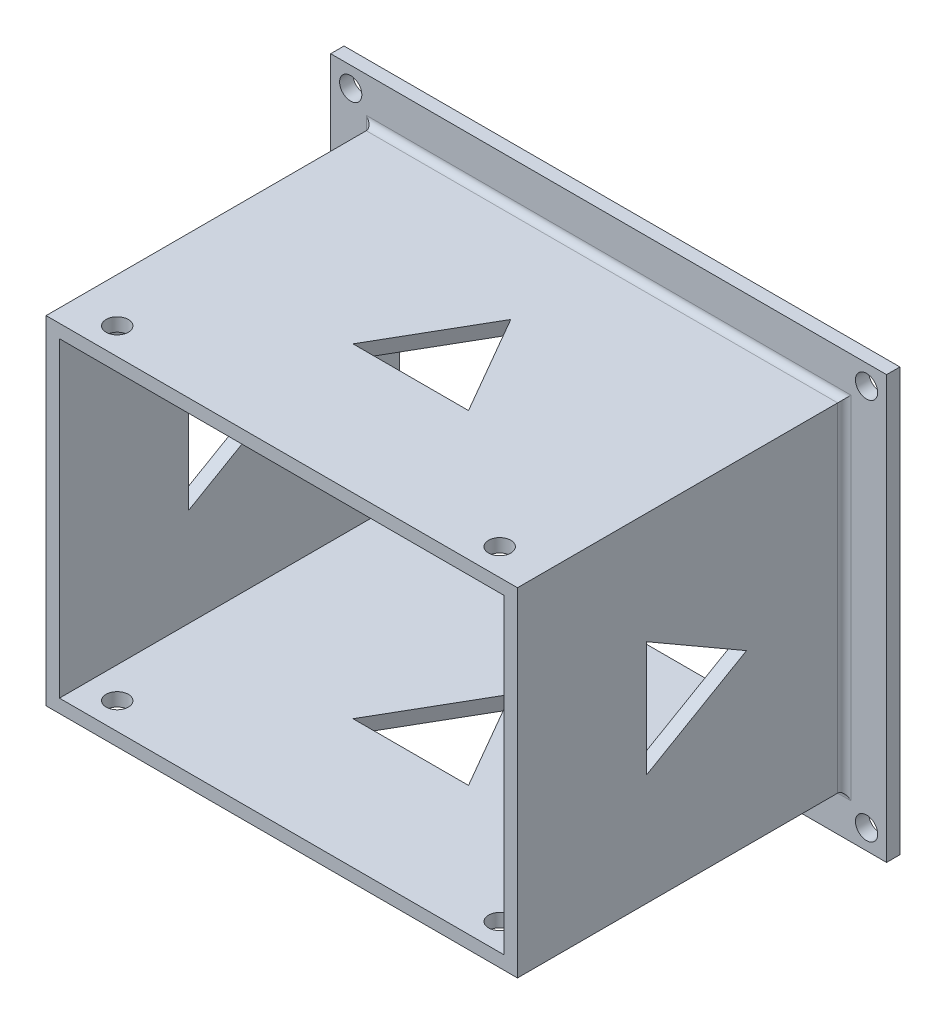
ISO-10303-21;
HEADER;
FILE_DESCRIPTION(('STEP AP214'),'2;1');
FILE_NAME('part.step','',(''),(''),'','','');
FILE_SCHEMA(('AUTOMOTIVE_DESIGN { 1 0 10303 214 1 1 1 1 }'));
ENDSEC;
DATA;
#1=APPLICATION_CONTEXT('core data for automotive mechanical design processes');
#2=APPLICATION_PROTOCOL_DEFINITION('international standard','automotive_design',2000,#1);
#3=PRODUCT_CONTEXT('',#1,'mechanical');
#4=PRODUCT('Part','Part','',(#3));
#5=PRODUCT_RELATED_PRODUCT_CATEGORY('part','',(#4));
#6=PRODUCT_DEFINITION_FORMATION('','',#4);
#7=PRODUCT_DEFINITION_CONTEXT('part definition',#1,'design');
#8=PRODUCT_DEFINITION('design','',#6,#7);
#9=PRODUCT_DEFINITION_SHAPE('','',#8);
#10=(LENGTH_UNIT() NAMED_UNIT(*) SI_UNIT(.MILLI.,.METRE.));
#11=(NAMED_UNIT(*) PLANE_ANGLE_UNIT() SI_UNIT($,.RADIAN.));
#12=(NAMED_UNIT(*) SI_UNIT($,.STERADIAN.) SOLID_ANGLE_UNIT());
#13=UNCERTAINTY_MEASURE_WITH_UNIT(LENGTH_MEASURE(1.E-05),#10,'distance_accuracy_value','');
#14=(GEOMETRIC_REPRESENTATION_CONTEXT(3) GLOBAL_UNCERTAINTY_ASSIGNED_CONTEXT((#13)) GLOBAL_UNIT_ASSIGNED_CONTEXT((#10,
#11,#12)) REPRESENTATION_CONTEXT('',''));
#15=CARTESIAN_POINT('',(0.,0.,0.));
#16=DIRECTION('',(0.,0.,1.));
#17=DIRECTION('',(1.,0.,0.));
#18=AXIS2_PLACEMENT_3D('',#15,#16,#17);
#19=CARTESIAN_POINT('',(0.,0.,3.));
#20=DIRECTION('',(0.,0.,1.));
#21=DIRECTION('',(1.,0.,0.));
#22=AXIS2_PLACEMENT_3D('',#19,#20,#21);
#23=PLANE('',#22);
#24=CARTESIAN_POINT('',(-58.,-43.,3.));
#25=DIRECTION('',(0.,0.,1.));
#26=DIRECTION('',(-1.,0.,0.));
#27=AXIS2_PLACEMENT_3D('',#24,#25,#26);
#28=CIRCLE('',#27,2.5);
#29=CARTESIAN_POINT('',(-60.5,-43.,3.));
#30=VERTEX_POINT('',#29);
#31=EDGE_CURVE('E331',#30,#30,#28,.T.);
#32=ORIENTED_EDGE('',*,*,#31,.F.);
#33=EDGE_LOOP('',(#32));
#34=FACE_BOUND('',#33,.T.);
#35=CARTESIAN_POINT('',(58.,-43.,3.));
#36=DIRECTION('',(0.,0.,1.));
#37=DIRECTION('',(1.,0.,0.));
#38=AXIS2_PLACEMENT_3D('',#35,#36,#37);
#39=CIRCLE('',#38,2.5);
#40=CARTESIAN_POINT('',(60.5,-43.,3.));
#41=VERTEX_POINT('',#40);
#42=EDGE_CURVE('E337',#41,#41,#39,.T.);
#43=ORIENTED_EDGE('',*,*,#42,.F.);
#44=EDGE_LOOP('',(#43));
#45=FACE_BOUND('',#44,.T.);
#46=CARTESIAN_POINT('',(58.,43.,3.));
#47=DIRECTION('',(0.,0.,1.));
#48=DIRECTION('',(-1.,0.,0.));
#49=AXIS2_PLACEMENT_3D('',#46,#47,#48);
#50=CIRCLE('',#49,2.5);
#51=CARTESIAN_POINT('',(55.5,43.,3.));
#52=VERTEX_POINT('',#51);
#53=EDGE_CURVE('E332',#52,#52,#50,.T.);
#54=ORIENTED_EDGE('',*,*,#53,.F.);
#55=EDGE_LOOP('',(#54));
#56=FACE_BOUND('',#55,.T.);
#57=CARTESIAN_POINT('',(-58.,43.,3.));
#58=DIRECTION('',(0.,0.,1.));
#59=DIRECTION('',(1.,0.,0.));
#60=AXIS2_PLACEMENT_3D('',#57,#58,#59);
#61=CIRCLE('',#60,2.5);
#62=CARTESIAN_POINT('',(-55.5,43.,3.));
#63=VERTEX_POINT('',#62);
#64=EDGE_CURVE('E336',#63,#63,#61,.T.);
#65=ORIENTED_EDGE('',*,*,#64,.F.);
#66=EDGE_LOOP('',(#65));
#67=FACE_BOUND('',#66,.T.);
#68=DIRECTION('',(0.,1.,0.));
#69=VECTOR('',#68,1.);
#70=CARTESIAN_POINT('',(54.5,0.,3.));
#71=LINE('',#70,#69);
#72=CARTESIAN_POINT('',(54.5,39.5,3.));
#73=VERTEX_POINT('',#72);
#74=CARTESIAN_POINT('',(54.5,-39.5,3.));
#75=VERTEX_POINT('',#74);
#76=EDGE_CURVE('E502',#73,#75,#71,.F.);
#77=ORIENTED_EDGE('',*,*,#76,.T.);
#78=DIRECTION('',(1.,0.,0.));
#79=VECTOR('',#78,1.);
#80=CARTESIAN_POINT('',(0.,-39.5,3.));
#81=LINE('',#80,#79);
#82=CARTESIAN_POINT('',(-54.5,-39.5,3.));
#83=VERTEX_POINT('',#82);
#84=EDGE_CURVE('E511',#75,#83,#81,.F.);
#85=ORIENTED_EDGE('',*,*,#84,.T.);
#86=DIRECTION('',(0.,-1.,0.));
#87=VECTOR('',#86,1.);
#88=CARTESIAN_POINT('',(-54.5,0.,3.));
#89=LINE('',#88,#87);
#90=CARTESIAN_POINT('',(-54.5,39.5,3.));
#91=VERTEX_POINT('',#90);
#92=EDGE_CURVE('E508',#83,#91,#89,.F.);
#93=ORIENTED_EDGE('',*,*,#92,.T.);
#94=DIRECTION('',(-1.,0.,0.));
#95=VECTOR('',#94,1.);
#96=CARTESIAN_POINT('',(0.,39.5,3.));
#97=LINE('',#96,#95);
#98=EDGE_CURVE('E505',#91,#73,#97,.F.);
#99=ORIENTED_EDGE('',*,*,#98,.T.);
#100=EDGE_LOOP('',(#77,#85,#93,#99));
#101=FACE_BOUND('',#100,.T.);
#102=DIRECTION('',(0.,1.,0.));
#103=VECTOR('',#102,1.);
#104=CARTESIAN_POINT('',(62.5,47.5,3.));
#105=LINE('',#104,#103);
#106=CARTESIAN_POINT('',(62.5,-47.5,3.));
#107=VERTEX_POINT('',#106);
#108=CARTESIAN_POINT('',(62.5,47.5,3.));
#109=VERTEX_POINT('',#108);
#110=EDGE_CURVE('E457',#107,#109,#105,.T.);
#111=ORIENTED_EDGE('',*,*,#110,.T.);
#112=DIRECTION('',(-1.,0.,0.));
#113=VECTOR('',#112,1.);
#114=CARTESIAN_POINT('',(-62.5,47.5,3.));
#115=LINE('',#114,#113);
#116=CARTESIAN_POINT('',(-62.5,47.5,3.));
#117=VERTEX_POINT('',#116);
#118=EDGE_CURVE('E461',#109,#117,#115,.T.);
#119=ORIENTED_EDGE('',*,*,#118,.T.);
#120=DIRECTION('',(0.,-1.,0.));
#121=VECTOR('',#120,1.);
#122=CARTESIAN_POINT('',(-62.5,47.5,3.));
#123=LINE('',#122,#121);
#124=CARTESIAN_POINT('',(-62.5,-47.5,3.));
#125=VERTEX_POINT('',#124);
#126=EDGE_CURVE('E465',#117,#125,#123,.T.);
#127=ORIENTED_EDGE('',*,*,#126,.T.);
#128=DIRECTION('',(1.,0.,0.));
#129=VECTOR('',#128,1.);
#130=CARTESIAN_POINT('',(-62.5,-47.5,3.));
#131=LINE('',#130,#129);
#132=EDGE_CURVE('E468',#125,#107,#131,.T.);
#133=ORIENTED_EDGE('',*,*,#132,.T.);
#134=EDGE_LOOP('',(#111,#119,#127,#133));
#135=FACE_BOUND('',#134,.T.);
#136=ADVANCED_FACE('F39',(#34,#45,#56,#67,#101,#135),#23,.T.);
#137=CARTESIAN_POINT('',(0.,0.,0.));
#138=DIRECTION('',(0.,0.,1.));
#139=DIRECTION('',(1.,0.,0.));
#140=AXIS2_PLACEMENT_3D('',#137,#138,#139);
#141=PLANE('',#140);
#142=CARTESIAN_POINT('',(-58.,-43.,0.));
#143=DIRECTION('',(0.,0.,1.));
#144=DIRECTION('',(1.,0.,0.));
#145=AXIS2_PLACEMENT_3D('',#142,#143,#144);
#146=CIRCLE('',#145,2.5);
#147=CARTESIAN_POINT('',(-55.5,-43.,0.));
#148=VERTEX_POINT('',#147);
#149=EDGE_CURVE('E43',#148,#148,#146,.T.);
#150=ORIENTED_EDGE('',*,*,#149,.T.);
#151=EDGE_LOOP('',(#150));
#152=FACE_BOUND('',#151,.T.);
#153=CARTESIAN_POINT('',(58.,-43.,0.));
#154=DIRECTION('',(0.,0.,1.));
#155=DIRECTION('',(1.,0.,0.));
#156=AXIS2_PLACEMENT_3D('',#153,#154,#155);
#157=CIRCLE('',#156,2.5);
#158=CARTESIAN_POINT('',(60.5,-43.,0.));
#159=VERTEX_POINT('',#158);
#160=EDGE_CURVE('E539',#159,#159,#157,.T.);
#161=ORIENTED_EDGE('',*,*,#160,.T.);
#162=EDGE_LOOP('',(#161));
#163=FACE_BOUND('',#162,.T.);
#164=CARTESIAN_POINT('',(58.,43.,0.));
#165=DIRECTION('',(0.,0.,1.));
#166=DIRECTION('',(1.,0.,0.));
#167=AXIS2_PLACEMENT_3D('',#164,#165,#166);
#168=CIRCLE('',#167,2.5);
#169=CARTESIAN_POINT('',(60.5,43.,0.));
#170=VERTEX_POINT('',#169);
#171=EDGE_CURVE('E536',#170,#170,#168,.T.);
#172=ORIENTED_EDGE('',*,*,#171,.T.);
#173=EDGE_LOOP('',(#172));
#174=FACE_BOUND('',#173,.T.);
#175=CARTESIAN_POINT('',(-58.,43.,0.));
#176=DIRECTION('',(0.,0.,1.));
#177=DIRECTION('',(1.,0.,0.));
#178=AXIS2_PLACEMENT_3D('',#175,#176,#177);
#179=CIRCLE('',#178,2.5);
#180=CARTESIAN_POINT('',(-55.5,43.,0.));
#181=VERTEX_POINT('',#180);
#182=EDGE_CURVE('E347',#181,#181,#179,.T.);
#183=ORIENTED_EDGE('',*,*,#182,.T.);
#184=EDGE_LOOP('',(#183));
#185=FACE_BOUND('',#184,.T.);
#186=DIRECTION('',(0.,1.,0.));
#187=VECTOR('',#186,1.);
#188=CARTESIAN_POINT('',(62.5,47.5,0.));
#189=LINE('',#188,#187);
#190=CARTESIAN_POINT('',(62.5,-47.5,0.));
#191=VERTEX_POINT('',#190);
#192=CARTESIAN_POINT('',(62.5,47.5,0.));
#193=VERTEX_POINT('',#192);
#194=EDGE_CURVE('E456',#191,#193,#189,.T.);
#195=ORIENTED_EDGE('',*,*,#194,.F.);
#196=DIRECTION('',(1.,0.,0.));
#197=VECTOR('',#196,1.);
#198=CARTESIAN_POINT('',(-62.5,-47.5,0.));
#199=LINE('',#198,#197);
#200=CARTESIAN_POINT('',(-62.5,-47.5,0.));
#201=VERTEX_POINT('',#200);
#202=EDGE_CURVE('E462',#201,#191,#199,.T.);
#203=ORIENTED_EDGE('',*,*,#202,.F.);
#204=DIRECTION('',(0.,-1.,0.));
#205=VECTOR('',#204,1.);
#206=CARTESIAN_POINT('',(-62.5,47.5,0.));
#207=LINE('',#206,#205);
#208=CARTESIAN_POINT('',(-62.5,47.5,0.));
#209=VERTEX_POINT('',#208);
#210=EDGE_CURVE('E478',#209,#201,#207,.T.);
#211=ORIENTED_EDGE('',*,*,#210,.F.);
#212=DIRECTION('',(-1.,0.,0.));
#213=VECTOR('',#212,1.);
#214=CARTESIAN_POINT('',(-62.5,47.5,0.));
#215=LINE('',#214,#213);
#216=EDGE_CURVE('E475',#193,#209,#215,.T.);
#217=ORIENTED_EDGE('',*,*,#216,.F.);
#218=EDGE_LOOP('',(#195,#203,#211,#217));
#219=FACE_BOUND('',#218,.T.);
#220=DIRECTION('',(0.,1.,0.));
#221=VECTOR('',#220,1.);
#222=CARTESIAN_POINT('',(50.,35.,0.));
#223=LINE('',#222,#221);
#224=CARTESIAN_POINT('',(50.,-35.,0.));
#225=VERTEX_POINT('',#224);
#226=CARTESIAN_POINT('',(50.,35.,0.));
#227=VERTEX_POINT('',#226);
#228=EDGE_CURVE('E426',#225,#227,#223,.T.);
#229=ORIENTED_EDGE('',*,*,#228,.T.);
#230=DIRECTION('',(-1.,0.,0.));
#231=VECTOR('',#230,1.);
#232=CARTESIAN_POINT('',(-50.,35.,0.));
#233=LINE('',#232,#231);
#234=CARTESIAN_POINT('',(-50.,35.,0.));
#235=VERTEX_POINT('',#234);
#236=EDGE_CURVE('E430',#227,#235,#233,.T.);
#237=ORIENTED_EDGE('',*,*,#236,.T.);
#238=DIRECTION('',(0.,-1.,0.));
#239=VECTOR('',#238,1.);
#240=CARTESIAN_POINT('',(-50.,35.,0.));
#241=LINE('',#240,#239);
#242=CARTESIAN_POINT('',(-50.,-35.,0.));
#243=VERTEX_POINT('',#242);
#244=EDGE_CURVE('E434',#235,#243,#241,.T.);
#245=ORIENTED_EDGE('',*,*,#244,.T.);
#246=DIRECTION('',(1.,0.,0.));
#247=VECTOR('',#246,1.);
#248=CARTESIAN_POINT('',(-50.,-35.,0.));
#249=LINE('',#248,#247);
#250=EDGE_CURVE('E438',#243,#225,#249,.T.);
#251=ORIENTED_EDGE('',*,*,#250,.T.);
#252=EDGE_LOOP('',(#229,#237,#245,#251));
#253=FACE_BOUND('',#252,.T.);
#254=ADVANCED_FACE('F548',(#152,#163,#174,#185,#219,#253),#141,.F.);
#255=CARTESIAN_POINT('',(62.5,47.5,3.));
#256=DIRECTION('',(-1.,0.,0.));
#257=DIRECTION('',(0.,0.,1.));
#258=AXIS2_PLACEMENT_3D('',#255,#256,#257);
#259=PLANE('',#258);
#260=ORIENTED_EDGE('',*,*,#194,.T.);
#261=DIRECTION('',(0.,0.,-1.));
#262=VECTOR('',#261,1.);
#263=CARTESIAN_POINT('',(62.5,47.5,3.));
#264=LINE('',#263,#262);
#265=EDGE_CURVE('E494',#109,#193,#264,.T.);
#266=ORIENTED_EDGE('',*,*,#265,.F.);
#267=ORIENTED_EDGE('',*,*,#110,.F.);
#268=DIRECTION('',(0.,0.,-1.));
#269=VECTOR('',#268,1.);
#270=CARTESIAN_POINT('',(62.5,-47.5,3.));
#271=LINE('',#270,#269);
#272=EDGE_CURVE('E471',#107,#191,#271,.T.);
#273=ORIENTED_EDGE('',*,*,#272,.T.);
#274=EDGE_LOOP('',(#260,#266,#267,#273));
#275=FACE_BOUND('',#274,.T.);
#276=ADVANCED_FACE('F574',(#275),#259,.F.);
#277=CARTESIAN_POINT('',(-62.5,47.5,3.));
#278=DIRECTION('',(0.,-1.,0.));
#279=DIRECTION('',(0.,0.,-1.));
#280=AXIS2_PLACEMENT_3D('',#277,#278,#279);
#281=PLANE('',#280);
#282=ORIENTED_EDGE('',*,*,#216,.T.);
#283=DIRECTION('',(0.,0.,-1.));
#284=VECTOR('',#283,1.);
#285=CARTESIAN_POINT('',(-62.5,47.5,3.));
#286=LINE('',#285,#284);
#287=EDGE_CURVE('E490',#117,#209,#286,.T.);
#288=ORIENTED_EDGE('',*,*,#287,.F.);
#289=ORIENTED_EDGE('',*,*,#118,.F.);
#290=ORIENTED_EDGE('',*,*,#265,.T.);
#291=EDGE_LOOP('',(#282,#288,#289,#290));
#292=FACE_BOUND('',#291,.T.);
#293=ADVANCED_FACE('F589',(#292),#281,.F.);
#294=CARTESIAN_POINT('',(-62.5,47.5,3.));
#295=DIRECTION('',(1.,0.,0.));
#296=DIRECTION('',(0.,0.,-1.));
#297=AXIS2_PLACEMENT_3D('',#294,#295,#296);
#298=PLANE('',#297);
#299=ORIENTED_EDGE('',*,*,#210,.T.);
#300=DIRECTION('',(0.,0.,-1.));
#301=VECTOR('',#300,1.);
#302=CARTESIAN_POINT('',(-62.5,-47.5,3.));
#303=LINE('',#302,#301);
#304=EDGE_CURVE('E486',#125,#201,#303,.T.);
#305=ORIENTED_EDGE('',*,*,#304,.F.);
#306=ORIENTED_EDGE('',*,*,#126,.F.);
#307=ORIENTED_EDGE('',*,*,#287,.T.);
#308=EDGE_LOOP('',(#299,#305,#306,#307));
#309=FACE_BOUND('',#308,.T.);
#310=ADVANCED_FACE('F585',(#309),#298,.F.);
#311=CARTESIAN_POINT('',(-62.5,-47.5,3.));
#312=DIRECTION('',(0.,1.,0.));
#313=DIRECTION('',(0.,0.,1.));
#314=AXIS2_PLACEMENT_3D('',#311,#312,#313);
#315=PLANE('',#314);
#316=ORIENTED_EDGE('',*,*,#202,.T.);
#317=ORIENTED_EDGE('',*,*,#272,.F.);
#318=ORIENTED_EDGE('',*,*,#132,.F.);
#319=ORIENTED_EDGE('',*,*,#304,.T.);
#320=EDGE_LOOP('',(#316,#317,#318,#319));
#321=FACE_BOUND('',#320,.T.);
#322=ADVANCED_FACE('F582',(#321),#315,.F.);
#323=CARTESIAN_POINT('',(50.,35.,3.));
#324=DIRECTION('',(-1.,0.,0.));
#325=DIRECTION('',(0.,0.,1.));
#326=AXIS2_PLACEMENT_3D('',#323,#324,#325);
#327=PLANE('',#326);
#328=DIRECTION('',(0.,-0.5,-0.866025403784439));
#329=VECTOR('',#328,1.);
#330=CARTESIAN_POINT('',(50.,-0.776279441628808,23.6554445662277));
#331=LINE('',#330,#329);
#332=CARTESIAN_POINT('',(50.,12.9903810567666,47.5));
#333=VERTEX_POINT('',#332);
#334=CARTESIAN_POINT('',(50.,0.,25.));
#335=VERTEX_POINT('',#334);
#336=EDGE_CURVE('E272',#333,#335,#331,.T.);
#337=ORIENTED_EDGE('',*,*,#336,.F.);
#338=DIRECTION('',(0.,1.,0.));
#339=VECTOR('',#338,1.);
#340=CARTESIAN_POINT('',(50.,35.,47.5));
#341=LINE('',#340,#339);
#342=CARTESIAN_POINT('',(50.,-12.9903810567666,47.5));
#343=VERTEX_POINT('',#342);
#344=EDGE_CURVE('E262',#343,#333,#341,.T.);
#345=ORIENTED_EDGE('',*,*,#344,.F.);
#346=DIRECTION('',(0.,-0.5,0.866025403784439));
#347=VECTOR('',#346,1.);
#348=CARTESIAN_POINT('',(50.,18.2762794416288,-6.65544456622769));
#349=LINE('',#348,#347);
#350=EDGE_CURVE('E253',#335,#343,#349,.T.);
#351=ORIENTED_EDGE('',*,*,#350,.F.);
#352=EDGE_LOOP('',(#337,#345,#351));
#353=FACE_BOUND('',#352,.T.);
#354=ORIENTED_EDGE('',*,*,#228,.F.);
#355=DIRECTION('',(0.,0.,-1.));
#356=VECTOR('',#355,1.);
#357=CARTESIAN_POINT('',(50.,-35.,3.));
#358=LINE('',#357,#356);
#359=CARTESIAN_POINT('',(50.,-35.,76.5));
#360=VERTEX_POINT('',#359);
#361=EDGE_CURVE('E442',#360,#225,#358,.T.);
#362=ORIENTED_EDGE('',*,*,#361,.F.);
#363=DIRECTION('',(0.,1.,0.));
#364=VECTOR('',#363,1.);
#365=CARTESIAN_POINT('',(50.,35.,76.5));
#366=LINE('',#365,#364);
#367=CARTESIAN_POINT('',(50.,35.,76.5));
#368=VERTEX_POINT('',#367);
#369=EDGE_CURVE('E381',#360,#368,#366,.T.);
#370=ORIENTED_EDGE('',*,*,#369,.T.);
#371=DIRECTION('',(0.,0.,-1.));
#372=VECTOR('',#371,1.);
#373=CARTESIAN_POINT('',(50.,35.,3.));
#374=LINE('',#373,#372);
#375=EDGE_CURVE('E452',#368,#227,#374,.T.);
#376=ORIENTED_EDGE('',*,*,#375,.T.);
#377=EDGE_LOOP('',(#354,#362,#370,#376));
#378=FACE_BOUND('',#377,.T.);
#379=ADVANCED_FACE('F579',(#353,#378),#327,.T.);
#380=CARTESIAN_POINT('',(-50.,35.,3.));
#381=DIRECTION('',(0.,-1.,0.));
#382=DIRECTION('',(0.,0.,-1.));
#383=AXIS2_PLACEMENT_3D('',#380,#381,#382);
#384=PLANE('',#383);
#385=DIRECTION('',(0.5,0.,-0.866025403784439));
#386=VECTOR('',#385,1.);
#387=CARTESIAN_POINT('',(-2.97372055837117,35.,30.150635094611));
#388=LINE('',#387,#386);
#389=CARTESIAN_POINT('',(-12.9903810567666,35.,47.5));
#390=VERTEX_POINT('',#389);
#391=CARTESIAN_POINT('',(0.,35.,25.));
#392=VERTEX_POINT('',#391);
#393=EDGE_CURVE('E327',#390,#392,#388,.T.);
#394=ORIENTED_EDGE('',*,*,#393,.F.);
#395=DIRECTION('',(-1.,0.,0.));
#396=VECTOR('',#395,1.);
#397=CARTESIAN_POINT('',(-50.,35.,47.5));
#398=LINE('',#397,#396);
#399=CARTESIAN_POINT('',(12.9903810567666,35.,47.5));
#400=VERTEX_POINT('',#399);
#401=EDGE_CURVE('E317',#400,#390,#398,.T.);
#402=ORIENTED_EDGE('',*,*,#401,.F.);
#403=DIRECTION('',(0.5,0.,0.866025403784439));
#404=VECTOR('',#403,1.);
#405=CARTESIAN_POINT('',(-22.0262794416288,35.,-13.150635094611));
#406=LINE('',#405,#404);
#407=EDGE_CURVE('E306',#392,#400,#406,.T.);
#408=ORIENTED_EDGE('',*,*,#407,.F.);
#409=EDGE_LOOP('',(#394,#402,#408));
#410=FACE_BOUND('',#409,.T.);
#411=CARTESIAN_POINT('',(-43.,35.,70.5));
#412=DIRECTION('',(0.,-1.,0.));
#413=DIRECTION('',(0.,0.,-1.));
#414=AXIS2_PLACEMENT_3D('',#411,#412,#413);
#415=CIRCLE('',#414,2.5);
#416=CARTESIAN_POINT('',(-43.,35.,68.));
#417=VERTEX_POINT('',#416);
#418=EDGE_CURVE('E377',#417,#417,#415,.T.);
#419=ORIENTED_EDGE('',*,*,#418,.F.);
#420=EDGE_LOOP('',(#419));
#421=FACE_BOUND('',#420,.T.);
#422=CARTESIAN_POINT('',(43.,35.,70.5));
#423=DIRECTION('',(0.,-1.,0.));
#424=DIRECTION('',(0.,0.,-1.));
#425=AXIS2_PLACEMENT_3D('',#422,#423,#424);
#426=CIRCLE('',#425,2.5);
#427=CARTESIAN_POINT('',(43.,35.,68.));
#428=VERTEX_POINT('',#427);
#429=EDGE_CURVE('E365',#428,#428,#426,.T.);
#430=ORIENTED_EDGE('',*,*,#429,.F.);
#431=EDGE_LOOP('',(#430));
#432=FACE_BOUND('',#431,.T.);
#433=ORIENTED_EDGE('',*,*,#236,.F.);
#434=ORIENTED_EDGE('',*,*,#375,.F.);
#435=DIRECTION('',(-1.,0.,0.));
#436=VECTOR('',#435,1.);
#437=CARTESIAN_POINT('',(-50.,35.,76.5));
#438=LINE('',#437,#436);
#439=CARTESIAN_POINT('',(-50.,35.,76.5));
#440=VERTEX_POINT('',#439);
#441=EDGE_CURVE('E385',#368,#440,#438,.T.);
#442=ORIENTED_EDGE('',*,*,#441,.T.);
#443=DIRECTION('',(0.,0.,-1.));
#444=VECTOR('',#443,1.);
#445=CARTESIAN_POINT('',(-50.,35.,3.));
#446=LINE('',#445,#444);
#447=EDGE_CURVE('E449',#440,#235,#446,.T.);
#448=ORIENTED_EDGE('',*,*,#447,.T.);
#449=EDGE_LOOP('',(#433,#434,#442,#448));
#450=FACE_BOUND('',#449,.T.);
#451=ADVANCED_FACE('F662',(#410,#421,#432,#450),#384,.T.);
#452=CARTESIAN_POINT('',(-50.,35.,3.));
#453=DIRECTION('',(1.,0.,0.));
#454=DIRECTION('',(0.,0.,-1.));
#455=AXIS2_PLACEMENT_3D('',#452,#453,#454);
#456=PLANE('',#455);
#457=DIRECTION('',(0.,0.5,0.866025403784439));
#458=VECTOR('',#457,1.);
#459=CARTESIAN_POINT('',(-50.,-0.776279441628808,23.6554445662277));
#460=LINE('',#459,#458);
#461=CARTESIAN_POINT('',(-50.,0.,25.));
#462=VERTEX_POINT('',#461);
#463=CARTESIAN_POINT('',(-50.,12.9903810567666,47.5));
#464=VERTEX_POINT('',#463);
#465=EDGE_CURVE('E269',#462,#464,#460,.T.);
#466=ORIENTED_EDGE('',*,*,#465,.F.);
#467=DIRECTION('',(0.,0.5,-0.866025403784439));
#468=VECTOR('',#467,1.);
#469=CARTESIAN_POINT('',(-50.,18.2762794416288,-6.65544456622769));
#470=LINE('',#469,#468);
#471=CARTESIAN_POINT('',(-50.,-12.9903810567666,47.5));
#472=VERTEX_POINT('',#471);
#473=EDGE_CURVE('E250',#472,#462,#470,.T.);
#474=ORIENTED_EDGE('',*,*,#473,.F.);
#475=DIRECTION('',(0.,-1.,0.));
#476=VECTOR('',#475,1.);
#477=CARTESIAN_POINT('',(-50.,35.,47.5));
#478=LINE('',#477,#476);
#479=EDGE_CURVE('E219',#464,#472,#478,.T.);
#480=ORIENTED_EDGE('',*,*,#479,.F.);
#481=EDGE_LOOP('',(#466,#474,#480));
#482=FACE_BOUND('',#481,.T.);
#483=ORIENTED_EDGE('',*,*,#244,.F.);
#484=ORIENTED_EDGE('',*,*,#447,.F.);
#485=DIRECTION('',(0.,-1.,0.));
#486=VECTOR('',#485,1.);
#487=CARTESIAN_POINT('',(-50.,35.,76.5));
#488=LINE('',#487,#486);
#489=CARTESIAN_POINT('',(-50.,-35.,76.5));
#490=VERTEX_POINT('',#489);
#491=EDGE_CURVE('E389',#440,#490,#488,.T.);
#492=ORIENTED_EDGE('',*,*,#491,.T.);
#493=DIRECTION('',(0.,0.,-1.));
#494=VECTOR('',#493,1.);
#495=CARTESIAN_POINT('',(-50.,-35.,3.));
#496=LINE('',#495,#494);
#497=EDGE_CURVE('E446',#490,#243,#496,.T.);
#498=ORIENTED_EDGE('',*,*,#497,.T.);
#499=EDGE_LOOP('',(#483,#484,#492,#498));
#500=FACE_BOUND('',#499,.T.);
#501=ADVANCED_FACE('F659',(#482,#500),#456,.T.);
#502=CARTESIAN_POINT('',(-50.,-35.,3.));
#503=DIRECTION('',(0.,1.,0.));
#504=DIRECTION('',(0.,0.,1.));
#505=AXIS2_PLACEMENT_3D('',#502,#503,#504);
#506=PLANE('',#505);
#507=DIRECTION('',(-0.5,0.,0.866025403784439));
#508=VECTOR('',#507,1.);
#509=CARTESIAN_POINT('',(-2.97372055837117,-35.,30.150635094611));
#510=LINE('',#509,#508);
#511=CARTESIAN_POINT('',(0.,-35.,25.));
#512=VERTEX_POINT('',#511);
#513=CARTESIAN_POINT('',(-12.9903810567666,-35.,47.5));
#514=VERTEX_POINT('',#513);
#515=EDGE_CURVE('E324',#512,#514,#510,.T.);
#516=ORIENTED_EDGE('',*,*,#515,.F.);
#517=DIRECTION('',(-0.5,0.,-0.866025403784439));
#518=VECTOR('',#517,1.);
#519=CARTESIAN_POINT('',(-22.0262794416288,-35.,-13.150635094611));
#520=LINE('',#519,#518);
#521=CARTESIAN_POINT('',(12.9903810567666,-35.,47.5));
#522=VERTEX_POINT('',#521);
#523=EDGE_CURVE('E303',#522,#512,#520,.T.);
#524=ORIENTED_EDGE('',*,*,#523,.F.);
#525=DIRECTION('',(1.,0.,0.));
#526=VECTOR('',#525,1.);
#527=CARTESIAN_POINT('',(-50.,-35.,47.5));
#528=LINE('',#527,#526);
#529=EDGE_CURVE('E313',#514,#522,#528,.T.);
#530=ORIENTED_EDGE('',*,*,#529,.F.);
#531=EDGE_LOOP('',(#516,#524,#530));
#532=FACE_BOUND('',#531,.T.);
#533=CARTESIAN_POINT('',(-43.,-35.,70.5));
#534=DIRECTION('',(0.,1.,0.));
#535=DIRECTION('',(0.,0.,1.));
#536=AXIS2_PLACEMENT_3D('',#533,#534,#535);
#537=CIRCLE('',#536,2.5);
#538=CARTESIAN_POINT('',(-43.,-35.,73.));
#539=VERTEX_POINT('',#538);
#540=EDGE_CURVE('E373',#539,#539,#537,.T.);
#541=ORIENTED_EDGE('',*,*,#540,.F.);
#542=EDGE_LOOP('',(#541));
#543=FACE_BOUND('',#542,.T.);
#544=CARTESIAN_POINT('',(43.,-35.,70.5));
#545=DIRECTION('',(0.,1.,0.));
#546=DIRECTION('',(0.,0.,1.));
#547=AXIS2_PLACEMENT_3D('',#544,#545,#546);
#548=CIRCLE('',#547,2.5);
#549=CARTESIAN_POINT('',(43.,-35.,73.));
#550=VERTEX_POINT('',#549);
#551=EDGE_CURVE('E361',#550,#550,#548,.T.);
#552=ORIENTED_EDGE('',*,*,#551,.F.);
#553=EDGE_LOOP('',(#552));
#554=FACE_BOUND('',#553,.T.);
#555=ORIENTED_EDGE('',*,*,#250,.F.);
#556=ORIENTED_EDGE('',*,*,#497,.F.);
#557=DIRECTION('',(1.,0.,0.));
#558=VECTOR('',#557,1.);
#559=CARTESIAN_POINT('',(-50.,-35.,76.5));
#560=LINE('',#559,#558);
#561=EDGE_CURVE('E393',#490,#360,#560,.T.);
#562=ORIENTED_EDGE('',*,*,#561,.T.);
#563=ORIENTED_EDGE('',*,*,#361,.T.);
#564=EDGE_LOOP('',(#555,#556,#562,#563));
#565=FACE_BOUND('',#564,.T.);
#566=ADVANCED_FACE('F656',(#532,#543,#554,#565),#506,.T.);
#567=CARTESIAN_POINT('',(0.,0.,76.5));
#568=DIRECTION('',(0.,0.,1.));
#569=DIRECTION('',(1.,0.,0.));
#570=AXIS2_PLACEMENT_3D('',#567,#568,#569);
#571=PLANE('',#570);
#572=DIRECTION('',(0.,1.,0.));
#573=VECTOR('',#572,1.);
#574=CARTESIAN_POINT('',(53.,38.,76.5));
#575=LINE('',#574,#573);
#576=CARTESIAN_POINT('',(53.,-38.,76.5));
#577=VERTEX_POINT('',#576);
#578=CARTESIAN_POINT('',(53.,38.,76.5));
#579=VERTEX_POINT('',#578);
#580=EDGE_CURVE('E397',#577,#579,#575,.T.);
#581=ORIENTED_EDGE('',*,*,#580,.T.);
#582=DIRECTION('',(-1.,0.,0.));
#583=VECTOR('',#582,1.);
#584=CARTESIAN_POINT('',(-53.,38.,76.5));
#585=LINE('',#584,#583);
#586=CARTESIAN_POINT('',(-53.,38.,76.5));
#587=VERTEX_POINT('',#586);
#588=EDGE_CURVE('E401',#579,#587,#585,.T.);
#589=ORIENTED_EDGE('',*,*,#588,.T.);
#590=DIRECTION('',(0.,-1.,0.));
#591=VECTOR('',#590,1.);
#592=CARTESIAN_POINT('',(-53.,38.,76.5));
#593=LINE('',#592,#591);
#594=CARTESIAN_POINT('',(-53.,-38.,76.5));
#595=VERTEX_POINT('',#594);
#596=EDGE_CURVE('E404',#587,#595,#593,.T.);
#597=ORIENTED_EDGE('',*,*,#596,.T.);
#598=DIRECTION('',(1.,0.,0.));
#599=VECTOR('',#598,1.);
#600=CARTESIAN_POINT('',(-53.,-38.,76.5));
#601=LINE('',#600,#599);
#602=EDGE_CURVE('E407',#595,#577,#601,.T.);
#603=ORIENTED_EDGE('',*,*,#602,.T.);
#604=EDGE_LOOP('',(#581,#589,#597,#603));
#605=FACE_BOUND('',#604,.T.);
#606=ORIENTED_EDGE('',*,*,#441,.F.);
#607=ORIENTED_EDGE('',*,*,#369,.F.);
#608=ORIENTED_EDGE('',*,*,#561,.F.);
#609=ORIENTED_EDGE('',*,*,#491,.F.);
#610=EDGE_LOOP('',(#606,#607,#608,#609));
#611=FACE_BOUND('',#610,.T.);
#612=ADVANCED_FACE('F637',(#605,#611),#571,.T.);
#613=CARTESIAN_POINT('',(53.,38.,76.5));
#614=DIRECTION('',(-1.,0.,0.));
#615=DIRECTION('',(0.,0.,1.));
#616=AXIS2_PLACEMENT_3D('',#613,#614,#615);
#617=PLANE('',#616);
#618=DIRECTION('',(0.,1.,0.));
#619=VECTOR('',#618,1.);
#620=CARTESIAN_POINT('',(53.,38.,47.5));
#621=LINE('',#620,#619);
#622=CARTESIAN_POINT('',(53.,-12.9903810567666,47.5));
#623=VERTEX_POINT('',#622);
#624=CARTESIAN_POINT('',(53.,12.9903810567666,47.5));
#625=VERTEX_POINT('',#624);
#626=EDGE_CURVE('E256',#623,#625,#621,.T.);
#627=ORIENTED_EDGE('',*,*,#626,.T.);
#628=DIRECTION('',(0.,-0.5,-0.866025403784439));
#629=VECTOR('',#628,1.);
#630=CARTESIAN_POINT('',(53.,31.8001541474493,80.0794826719043));
#631=LINE('',#630,#629);
#632=CARTESIAN_POINT('',(53.,0.,25.));
#633=VERTEX_POINT('',#632);
#634=EDGE_CURVE('E265',#625,#633,#631,.T.);
#635=ORIENTED_EDGE('',*,*,#634,.T.);
#636=DIRECTION('',(0.,-0.5,0.866025403784439));
#637=VECTOR('',#636,1.);
#638=CARTESIAN_POINT('',(53.,-12.8001541474493,47.1705173280957));
#639=LINE('',#638,#637);
#640=EDGE_CURVE('E246',#633,#623,#639,.T.);
#641=ORIENTED_EDGE('',*,*,#640,.T.);
#642=EDGE_LOOP('',(#627,#635,#641));
#643=FACE_BOUND('',#642,.T.);
#644=DIRECTION('',(0.,0.,-1.));
#645=VECTOR('',#644,1.);
#646=CARTESIAN_POINT('',(53.,-38.,76.5));
#647=LINE('',#646,#645);
#648=CARTESIAN_POINT('',(53.,-38.,4.5));
#649=VERTEX_POINT('',#648);
#650=EDGE_CURVE('E410',#577,#649,#647,.T.);
#651=ORIENTED_EDGE('',*,*,#650,.T.);
#652=DIRECTION('',(0.,1.,0.));
#653=VECTOR('',#652,1.);
#654=CARTESIAN_POINT('',(53.,38.,4.5));
#655=LINE('',#654,#653);
#656=CARTESIAN_POINT('',(53.,38.,4.5));
#657=VERTEX_POINT('',#656);
#658=EDGE_CURVE('E11',#649,#657,#655,.T.);
#659=ORIENTED_EDGE('',*,*,#658,.T.);
#660=DIRECTION('',(0.,0.,-1.));
#661=VECTOR('',#660,1.);
#662=CARTESIAN_POINT('',(53.,38.,76.5));
#663=LINE('',#662,#661);
#664=EDGE_CURVE('E422',#579,#657,#663,.T.);
#665=ORIENTED_EDGE('',*,*,#664,.F.);
#666=ORIENTED_EDGE('',*,*,#580,.F.);
#667=EDGE_LOOP('',(#651,#659,#665,#666));
#668=FACE_BOUND('',#667,.T.);
#669=ADVANCED_FACE('F635',(#643,#668),#617,.F.);
#670=CARTESIAN_POINT('',(-53.,38.,76.5));
#671=DIRECTION('',(0.,-1.,0.));
#672=DIRECTION('',(0.,0.,-1.));
#673=AXIS2_PLACEMENT_3D('',#670,#671,#672);
#674=PLANE('',#673);
#675=DIRECTION('',(-1.,0.,0.));
#676=VECTOR('',#675,1.);
#677=CARTESIAN_POINT('',(-53.,38.,47.5));
#678=LINE('',#677,#676);
#679=CARTESIAN_POINT('',(12.9903810567666,38.,47.5));
#680=VERTEX_POINT('',#679);
#681=CARTESIAN_POINT('',(-12.9903810567666,38.,47.5));
#682=VERTEX_POINT('',#681);
#683=EDGE_CURVE('E309',#680,#682,#678,.T.);
#684=ORIENTED_EDGE('',*,*,#683,.T.);
#685=DIRECTION('',(0.5,0.,-0.866025403784439));
#686=VECTOR('',#685,1.);
#687=CARTESIAN_POINT('',(-35.5501541474493,38.,86.5746732002876));
#688=LINE('',#687,#686);
#689=CARTESIAN_POINT('',(0.,38.,25.));
#690=VERTEX_POINT('',#689);
#691=EDGE_CURVE('E320',#682,#690,#688,.T.);
#692=ORIENTED_EDGE('',*,*,#691,.T.);
#693=DIRECTION('',(0.5,0.,0.866025403784439));
#694=VECTOR('',#693,1.);
#695=CARTESIAN_POINT('',(9.05015414744929,38.,40.6753267997124));
#696=LINE('',#695,#694);
#697=EDGE_CURVE('E299',#690,#680,#696,.T.);
#698=ORIENTED_EDGE('',*,*,#697,.T.);
#699=EDGE_LOOP('',(#684,#692,#698));
#700=FACE_BOUND('',#699,.T.);
#701=CARTESIAN_POINT('',(-43.,38.,70.5));
#702=DIRECTION('',(0.,-1.,0.));
#703=DIRECTION('',(0.,0.,-1.));
#704=AXIS2_PLACEMENT_3D('',#701,#702,#703);
#705=CIRCLE('',#704,2.5);
#706=CARTESIAN_POINT('',(-43.,38.,68.));
#707=VERTEX_POINT('',#706);
#708=EDGE_CURVE('E369',#707,#707,#705,.T.);
#709=ORIENTED_EDGE('',*,*,#708,.T.);
#710=EDGE_LOOP('',(#709));
#711=FACE_BOUND('',#710,.T.);
#712=CARTESIAN_POINT('',(43.,38.,70.5));
#713=DIRECTION('',(0.,-1.,0.));
#714=DIRECTION('',(0.,0.,-1.));
#715=AXIS2_PLACEMENT_3D('',#712,#713,#714);
#716=CIRCLE('',#715,2.5);
#717=CARTESIAN_POINT('',(43.,38.,68.));
#718=VERTEX_POINT('',#717);
#719=EDGE_CURVE('E352',#718,#718,#716,.T.);
#720=ORIENTED_EDGE('',*,*,#719,.T.);
#721=EDGE_LOOP('',(#720));
#722=FACE_BOUND('',#721,.T.);
#723=ORIENTED_EDGE('',*,*,#664,.T.);
#724=DIRECTION('',(-1.,0.,0.));
#725=VECTOR('',#724,1.);
#726=CARTESIAN_POINT('',(-53.,38.,4.5));
#727=LINE('',#726,#725);
#728=CARTESIAN_POINT('',(-53.,38.,4.5));
#729=VERTEX_POINT('',#728);
#730=EDGE_CURVE('E49',#657,#729,#727,.T.);
#731=ORIENTED_EDGE('',*,*,#730,.T.);
#732=DIRECTION('',(0.,0.,-1.));
#733=VECTOR('',#732,1.);
#734=CARTESIAN_POINT('',(-53.,38.,76.5));
#735=LINE('',#734,#733);
#736=EDGE_CURVE('E418',#587,#729,#735,.T.);
#737=ORIENTED_EDGE('',*,*,#736,.F.);
#738=ORIENTED_EDGE('',*,*,#588,.F.);
#739=EDGE_LOOP('',(#723,#731,#737,#738));
#740=FACE_BOUND('',#739,.T.);
#741=ADVANCED_FACE('F642',(#700,#711,#722,#740),#674,.F.);
#742=CARTESIAN_POINT('',(-53.,38.,76.5));
#743=DIRECTION('',(1.,0.,0.));
#744=DIRECTION('',(0.,0.,-1.));
#745=AXIS2_PLACEMENT_3D('',#742,#743,#744);
#746=PLANE('',#745);
#747=DIRECTION('',(0.,-0.5,0.866025403784439));
#748=VECTOR('',#747,1.);
#749=CARTESIAN_POINT('',(-53.,0.,25.));
#750=LINE('',#749,#748);
#751=CARTESIAN_POINT('',(-53.,0.,25.));
#752=VERTEX_POINT('',#751);
#753=CARTESIAN_POINT('',(-53.,-12.9903810567666,47.5));
#754=VERTEX_POINT('',#753);
#755=EDGE_CURVE('E226',#752,#754,#750,.T.);
#756=ORIENTED_EDGE('',*,*,#755,.F.);
#757=DIRECTION('',(0.,-0.5,-0.866025403784438));
#758=VECTOR('',#757,1.);
#759=CARTESIAN_POINT('',(-53.,12.9903810567666,47.5));
#760=LINE('',#759,#758);
#761=CARTESIAN_POINT('',(-53.,12.9903810567666,47.5));
#762=VERTEX_POINT('',#761);
#763=EDGE_CURVE('E232',#762,#752,#760,.T.);
#764=ORIENTED_EDGE('',*,*,#763,.F.);
#765=DIRECTION('',(0.,1.,0.));
#766=VECTOR('',#765,1.);
#767=CARTESIAN_POINT('',(-53.,-12.9903810567666,47.5));
#768=LINE('',#767,#766);
#769=EDGE_CURVE('E216',#754,#762,#768,.T.);
#770=ORIENTED_EDGE('',*,*,#769,.F.);
#771=EDGE_LOOP('',(#756,#764,#770));
#772=FACE_BOUND('',#771,.T.);
#773=ORIENTED_EDGE('',*,*,#736,.T.);
#774=DIRECTION('',(0.,-1.,0.));
#775=VECTOR('',#774,1.);
#776=CARTESIAN_POINT('',(-53.,38.,4.5));
#777=LINE('',#776,#775);
#778=CARTESIAN_POINT('',(-53.,-38.,4.5));
#779=VERTEX_POINT('',#778);
#780=EDGE_CURVE('E515',#729,#779,#777,.T.);
#781=ORIENTED_EDGE('',*,*,#780,.T.);
#782=DIRECTION('',(0.,0.,-1.));
#783=VECTOR('',#782,1.);
#784=CARTESIAN_POINT('',(-53.,-38.,76.5));
#785=LINE('',#784,#783);
#786=EDGE_CURVE('E414',#595,#779,#785,.T.);
#787=ORIENTED_EDGE('',*,*,#786,.F.);
#788=ORIENTED_EDGE('',*,*,#596,.F.);
#789=EDGE_LOOP('',(#773,#781,#787,#788));
#790=FACE_BOUND('',#789,.T.);
#791=ADVANCED_FACE('F234',(#772,#790),#746,.F.);
#792=CARTESIAN_POINT('',(-53.,-38.,76.5));
#793=DIRECTION('',(0.,1.,0.));
#794=DIRECTION('',(0.,0.,1.));
#795=AXIS2_PLACEMENT_3D('',#792,#793,#794);
#796=PLANE('',#795);
#797=DIRECTION('',(0.5,0.,0.866025403784438));
#798=VECTOR('',#797,1.);
#799=CARTESIAN_POINT('',(0.,-38.,25.));
#800=LINE('',#799,#798);
#801=CARTESIAN_POINT('',(0.,-38.,25.));
#802=VERTEX_POINT('',#801);
#803=CARTESIAN_POINT('',(12.9903810567666,-38.,47.5));
#804=VERTEX_POINT('',#803);
#805=EDGE_CURVE('E278',#802,#804,#800,.T.);
#806=ORIENTED_EDGE('',*,*,#805,.F.);
#807=DIRECTION('',(0.5,0.,-0.866025403784439));
#808=VECTOR('',#807,1.);
#809=CARTESIAN_POINT('',(-12.9903810567666,-38.,47.5));
#810=LINE('',#809,#808);
#811=CARTESIAN_POINT('',(-12.9903810567666,-38.,47.5));
#812=VERTEX_POINT('',#811);
#813=EDGE_CURVE('E275',#812,#802,#810,.T.);
#814=ORIENTED_EDGE('',*,*,#813,.F.);
#815=DIRECTION('',(-1.,0.,0.));
#816=VECTOR('',#815,1.);
#817=CARTESIAN_POINT('',(12.9903810567666,-38.,47.5));
#818=LINE('',#817,#816);
#819=EDGE_CURVE('E282',#804,#812,#818,.T.);
#820=ORIENTED_EDGE('',*,*,#819,.F.);
#821=EDGE_LOOP('',(#806,#814,#820));
#822=FACE_BOUND('',#821,.T.);
#823=CARTESIAN_POINT('',(-43.,-38.,70.5));
#824=DIRECTION('',(0.,-1.,0.));
#825=DIRECTION('',(0.,0.,-1.));
#826=AXIS2_PLACEMENT_3D('',#823,#824,#825);
#827=CIRCLE('',#826,2.5);
#828=CARTESIAN_POINT('',(-43.,-38.,68.));
#829=VERTEX_POINT('',#828);
#830=EDGE_CURVE('E348',#829,#829,#827,.T.);
#831=ORIENTED_EDGE('',*,*,#830,.F.);
#832=EDGE_LOOP('',(#831));
#833=FACE_BOUND('',#832,.T.);
#834=CARTESIAN_POINT('',(43.,-38.,70.5));
#835=DIRECTION('',(0.,-1.,0.));
#836=DIRECTION('',(0.,0.,1.));
#837=AXIS2_PLACEMENT_3D('',#834,#835,#836);
#838=CIRCLE('',#837,2.5);
#839=CARTESIAN_POINT('',(43.,-38.,73.));
#840=VERTEX_POINT('',#839);
#841=EDGE_CURVE('E353',#840,#840,#838,.T.);
#842=ORIENTED_EDGE('',*,*,#841,.F.);
#843=EDGE_LOOP('',(#842));
#844=FACE_BOUND('',#843,.T.);
#845=ORIENTED_EDGE('',*,*,#786,.T.);
#846=DIRECTION('',(1.,0.,0.));
#847=VECTOR('',#846,1.);
#848=CARTESIAN_POINT('',(-53.,-38.,4.5));
#849=LINE('',#848,#847);
#850=EDGE_CURVE('E498',#779,#649,#849,.T.);
#851=ORIENTED_EDGE('',*,*,#850,.T.);
#852=ORIENTED_EDGE('',*,*,#650,.F.);
#853=ORIENTED_EDGE('',*,*,#602,.F.);
#854=EDGE_LOOP('',(#845,#851,#852,#853));
#855=FACE_BOUND('',#854,.T.);
#856=ADVANCED_FACE('F631',(#822,#833,#844,#855),#796,.F.);
#857=CARTESIAN_POINT('',(43.,75.5,70.5));
#858=DIRECTION('',(0.,-1.,0.));
#859=DIRECTION('',(0.,0.,-1.));
#860=AXIS2_PLACEMENT_3D('',#857,#858,#859);
#861=CYLINDRICAL_SURFACE('',#860,2.5);
#862=ORIENTED_EDGE('',*,*,#551,.T.);
#863=EDGE_LOOP('',(#862));
#864=FACE_BOUND('',#863,.T.);
#865=ORIENTED_EDGE('',*,*,#841,.T.);
#866=EDGE_LOOP('',(#865));
#867=FACE_BOUND('',#866,.T.);
#868=ADVANCED_FACE('F696',(#864,#867),#861,.F.);
#869=CARTESIAN_POINT('',(-43.,75.5,70.5));
#870=DIRECTION('',(0.,-1.,0.));
#871=DIRECTION('',(0.,0.,-1.));
#872=AXIS2_PLACEMENT_3D('',#869,#870,#871);
#873=CYLINDRICAL_SURFACE('',#872,2.5);
#874=ORIENTED_EDGE('',*,*,#540,.T.);
#875=EDGE_LOOP('',(#874));
#876=FACE_BOUND('',#875,.T.);
#877=ORIENTED_EDGE('',*,*,#830,.T.);
#878=EDGE_LOOP('',(#877));
#879=FACE_BOUND('',#878,.T.);
#880=ADVANCED_FACE('F701',(#876,#879),#873,.F.);
#881=ORIENTED_EDGE('',*,*,#429,.T.);
#882=EDGE_LOOP('',(#881));
#883=FACE_BOUND('',#882,.T.);
#884=ORIENTED_EDGE('',*,*,#719,.F.);
#885=EDGE_LOOP('',(#884));
#886=FACE_BOUND('',#885,.T.);
#887=ADVANCED_FACE('F693',(#883,#886),#861,.F.);
#888=ORIENTED_EDGE('',*,*,#418,.T.);
#889=EDGE_LOOP('',(#888));
#890=FACE_BOUND('',#889,.T.);
#891=ORIENTED_EDGE('',*,*,#708,.F.);
#892=EDGE_LOOP('',(#891));
#893=FACE_BOUND('',#892,.T.);
#894=ADVANCED_FACE('F611',(#890,#893),#873,.F.);
#895=CARTESIAN_POINT('',(-53.,39.5,4.5));
#896=DIRECTION('',(-1.,0.,0.));
#897=DIRECTION('',(0.,0.,1.));
#898=AXIS2_PLACEMENT_3D('',#895,#896,#897);
#899=CYLINDRICAL_SURFACE('',#898,1.5);
#900=CARTESIAN_POINT('',(54.5,39.5,4.5));
#901=DIRECTION('',(-0.707106781186547,0.707106781186547,0.));
#902=DIRECTION('',(0.707106781186547,0.707106781186547,0.));
#903=AXIS2_PLACEMENT_3D('',#900,#901,#902);
#904=ELLIPSE('',#903,2.12132034355964,1.5);
#905=EDGE_CURVE('E526',#73,#657,#904,.T.);
#906=ORIENTED_EDGE('',*,*,#905,.F.);
#907=ORIENTED_EDGE('',*,*,#98,.F.);
#908=CARTESIAN_POINT('',(-54.5,39.5,4.5));
#909=DIRECTION('',(-0.707106781186547,-0.707106781186547,0.));
#910=DIRECTION('',(-0.707106781186547,0.707106781186547,0.));
#911=AXIS2_PLACEMENT_3D('',#908,#909,#910);
#912=ELLIPSE('',#911,2.12132034355964,1.5);
#913=EDGE_CURVE('E357',#729,#91,#912,.F.);
#914=ORIENTED_EDGE('',*,*,#913,.F.);
#915=ORIENTED_EDGE('',*,*,#730,.F.);
#916=EDGE_LOOP('',(#906,#907,#914,#915));
#917=FACE_BOUND('',#916,.T.);
#918=ADVANCED_FACE('F41',(#917),#899,.F.);
#919=CARTESIAN_POINT('',(-54.5,38.,4.5));
#920=DIRECTION('',(0.,-1.,0.));
#921=DIRECTION('',(0.,0.,-1.));
#922=AXIS2_PLACEMENT_3D('',#919,#920,#921);
#923=CYLINDRICAL_SURFACE('',#922,1.5);
#924=ORIENTED_EDGE('',*,*,#913,.T.);
#925=ORIENTED_EDGE('',*,*,#92,.F.);
#926=CARTESIAN_POINT('',(-54.5,-39.5,4.5));
#927=DIRECTION('',(0.707106781186547,-0.707106781186547,0.));
#928=DIRECTION('',(-0.707106781186547,-0.707106781186547,0.));
#929=AXIS2_PLACEMENT_3D('',#926,#927,#928);
#930=ELLIPSE('',#929,2.12132034355964,1.5);
#931=EDGE_CURVE('E523',#779,#83,#930,.F.);
#932=ORIENTED_EDGE('',*,*,#931,.F.);
#933=ORIENTED_EDGE('',*,*,#780,.F.);
#934=EDGE_LOOP('',(#924,#925,#932,#933));
#935=FACE_BOUND('',#934,.T.);
#936=ADVANCED_FACE('F604',(#935),#923,.F.);
#937=CARTESIAN_POINT('',(54.5,38.,4.5));
#938=DIRECTION('',(0.,1.,0.));
#939=DIRECTION('',(0.,0.,1.));
#940=AXIS2_PLACEMENT_3D('',#937,#938,#939);
#941=CYLINDRICAL_SURFACE('',#940,1.5);
#942=ORIENTED_EDGE('',*,*,#905,.T.);
#943=ORIENTED_EDGE('',*,*,#658,.F.);
#944=CARTESIAN_POINT('',(54.5,-39.5,4.5));
#945=DIRECTION('',(0.707106781186547,0.707106781186547,0.));
#946=DIRECTION('',(-0.707106781186547,0.707106781186547,0.));
#947=AXIS2_PLACEMENT_3D('',#944,#945,#946);
#948=ELLIPSE('',#947,2.12132034355964,1.5);
#949=EDGE_CURVE('E520',#75,#649,#948,.T.);
#950=ORIENTED_EDGE('',*,*,#949,.F.);
#951=ORIENTED_EDGE('',*,*,#76,.F.);
#952=EDGE_LOOP('',(#942,#943,#950,#951));
#953=FACE_BOUND('',#952,.T.);
#954=ADVANCED_FACE('F601',(#953),#941,.F.);
#955=CARTESIAN_POINT('',(-53.,-39.5,4.5));
#956=DIRECTION('',(1.,0.,0.));
#957=DIRECTION('',(0.,0.,-1.));
#958=AXIS2_PLACEMENT_3D('',#955,#956,#957);
#959=CYLINDRICAL_SURFACE('',#958,1.5);
#960=ORIENTED_EDGE('',*,*,#931,.T.);
#961=ORIENTED_EDGE('',*,*,#84,.F.);
#962=ORIENTED_EDGE('',*,*,#949,.T.);
#963=ORIENTED_EDGE('',*,*,#850,.F.);
#964=EDGE_LOOP('',(#960,#961,#962,#963));
#965=FACE_BOUND('',#964,.T.);
#966=ADVANCED_FACE('F597',(#965),#959,.F.);
#967=CARTESIAN_POINT('',(-58.,43.,-110.5));
#968=DIRECTION('',(0.,0.,1.));
#969=DIRECTION('',(1.,0.,0.));
#970=AXIS2_PLACEMENT_3D('',#967,#968,#969);
#971=CYLINDRICAL_SURFACE('',#970,2.5);
#972=ORIENTED_EDGE('',*,*,#64,.T.);
#973=EDGE_LOOP('',(#972));
#974=FACE_BOUND('',#973,.T.);
#975=ORIENTED_EDGE('',*,*,#182,.F.);
#976=EDGE_LOOP('',(#975));
#977=FACE_BOUND('',#976,.T.);
#978=ADVANCED_FACE('F600',(#974,#977),#971,.F.);
#979=CARTESIAN_POINT('',(58.,43.,-110.5));
#980=DIRECTION('',(0.,0.,1.));
#981=DIRECTION('',(1.,0.,0.));
#982=AXIS2_PLACEMENT_3D('',#979,#980,#981);
#983=CYLINDRICAL_SURFACE('',#982,2.5);
#984=ORIENTED_EDGE('',*,*,#53,.T.);
#985=EDGE_LOOP('',(#984));
#986=FACE_BOUND('',#985,.T.);
#987=ORIENTED_EDGE('',*,*,#171,.F.);
#988=EDGE_LOOP('',(#987));
#989=FACE_BOUND('',#988,.T.);
#990=ADVANCED_FACE('F564',(#986,#989),#983,.F.);
#991=CARTESIAN_POINT('',(58.,-43.,-110.5));
#992=DIRECTION('',(0.,0.,1.));
#993=DIRECTION('',(1.,0.,0.));
#994=AXIS2_PLACEMENT_3D('',#991,#992,#993);
#995=CYLINDRICAL_SURFACE('',#994,2.5);
#996=ORIENTED_EDGE('',*,*,#42,.T.);
#997=EDGE_LOOP('',(#996));
#998=FACE_BOUND('',#997,.T.);
#999=ORIENTED_EDGE('',*,*,#160,.F.);
#1000=EDGE_LOOP('',(#999));
#1001=FACE_BOUND('',#1000,.T.);
#1002=ADVANCED_FACE('F553',(#998,#1001),#995,.F.);
#1003=CARTESIAN_POINT('',(-58.,-43.,-110.5));
#1004=DIRECTION('',(0.,0.,1.));
#1005=DIRECTION('',(1.,0.,0.));
#1006=AXIS2_PLACEMENT_3D('',#1003,#1004,#1005);
#1007=CYLINDRICAL_SURFACE('',#1006,2.5);
#1008=ORIENTED_EDGE('',*,*,#31,.T.);
#1009=EDGE_LOOP('',(#1008));
#1010=FACE_BOUND('',#1009,.T.);
#1011=ORIENTED_EDGE('',*,*,#149,.F.);
#1012=EDGE_LOOP('',(#1011));
#1013=FACE_BOUND('',#1012,.T.);
#1014=ADVANCED_FACE('F550',(#1010,#1013),#1007,.F.);
#1015=CARTESIAN_POINT('',(0.,75.5,25.));
#1016=DIRECTION('',(0.866025403784439,0.,-0.5));
#1017=DIRECTION('',(-0.5,0.,-0.866025403784439));
#1018=AXIS2_PLACEMENT_3D('',#1015,#1016,#1017);
#1019=PLANE('',#1018);
#1020=ORIENTED_EDGE('',*,*,#523,.T.);
#1021=DIRECTION('',(0.,-1.,0.));
#1022=VECTOR('',#1021,1.);
#1023=CARTESIAN_POINT('',(0.,75.5,25.));
#1024=LINE('',#1023,#1022);
#1025=EDGE_CURVE('E286',#512,#802,#1024,.T.);
#1026=ORIENTED_EDGE('',*,*,#1025,.T.);
#1027=ORIENTED_EDGE('',*,*,#805,.T.);
#1028=DIRECTION('',(0.,-1.,0.));
#1029=VECTOR('',#1028,1.);
#1030=CARTESIAN_POINT('',(12.9903810567666,75.5,47.5));
#1031=LINE('',#1030,#1029);
#1032=EDGE_CURVE('E292',#522,#804,#1031,.T.);
#1033=ORIENTED_EDGE('',*,*,#1032,.F.);
#1034=EDGE_LOOP('',(#1020,#1026,#1027,#1033));
#1035=FACE_BOUND('',#1034,.T.);
#1036=ADVANCED_FACE('F552',(#1035),#1019,.F.);
#1037=CARTESIAN_POINT('',(12.9903810567666,75.5,47.5));
#1038=DIRECTION('',(0.,0.,1.));
#1039=DIRECTION('',(1.,0.,0.));
#1040=AXIS2_PLACEMENT_3D('',#1037,#1038,#1039);
#1041=PLANE('',#1040);
#1042=ORIENTED_EDGE('',*,*,#529,.T.);
#1043=ORIENTED_EDGE('',*,*,#1032,.T.);
#1044=ORIENTED_EDGE('',*,*,#819,.T.);
#1045=DIRECTION('',(0.,-1.,0.));
#1046=VECTOR('',#1045,1.);
#1047=CARTESIAN_POINT('',(-12.9903810567666,75.5,47.5));
#1048=LINE('',#1047,#1046);
#1049=EDGE_CURVE('E287',#514,#812,#1048,.T.);
#1050=ORIENTED_EDGE('',*,*,#1049,.F.);
#1051=EDGE_LOOP('',(#1042,#1043,#1044,#1050));
#1052=FACE_BOUND('',#1051,.T.);
#1053=ADVANCED_FACE('F560',(#1052),#1041,.F.);
#1054=CARTESIAN_POINT('',(-12.9903810567666,75.5,47.5));
#1055=DIRECTION('',(-0.866025403784439,0.,-0.5));
#1056=DIRECTION('',(-0.5,0.,0.866025403784439));
#1057=AXIS2_PLACEMENT_3D('',#1054,#1055,#1056);
#1058=PLANE('',#1057);
#1059=ORIENTED_EDGE('',*,*,#515,.T.);
#1060=ORIENTED_EDGE('',*,*,#1049,.T.);
#1061=ORIENTED_EDGE('',*,*,#813,.T.);
#1062=ORIENTED_EDGE('',*,*,#1025,.F.);
#1063=EDGE_LOOP('',(#1059,#1060,#1061,#1062));
#1064=FACE_BOUND('',#1063,.T.);
#1065=ADVANCED_FACE('F828',(#1064),#1058,.F.);
#1066=ORIENTED_EDGE('',*,*,#393,.T.);
#1067=EDGE_CURVE('E295',#690,#392,#1024,.T.);
#1068=ORIENTED_EDGE('',*,*,#1067,.F.);
#1069=ORIENTED_EDGE('',*,*,#691,.F.);
#1070=EDGE_CURVE('E290',#682,#390,#1048,.T.);
#1071=ORIENTED_EDGE('',*,*,#1070,.T.);
#1072=EDGE_LOOP('',(#1066,#1068,#1069,#1071));
#1073=FACE_BOUND('',#1072,.T.);
#1074=ADVANCED_FACE('F839',(#1073),#1058,.F.);
#1075=ORIENTED_EDGE('',*,*,#401,.T.);
#1076=ORIENTED_EDGE('',*,*,#1070,.F.);
#1077=ORIENTED_EDGE('',*,*,#683,.F.);
#1078=EDGE_CURVE('E291',#680,#400,#1031,.T.);
#1079=ORIENTED_EDGE('',*,*,#1078,.T.);
#1080=EDGE_LOOP('',(#1075,#1076,#1077,#1079));
#1081=FACE_BOUND('',#1080,.T.);
#1082=ADVANCED_FACE('F831',(#1081),#1041,.F.);
#1083=ORIENTED_EDGE('',*,*,#407,.T.);
#1084=ORIENTED_EDGE('',*,*,#1078,.F.);
#1085=ORIENTED_EDGE('',*,*,#697,.F.);
#1086=ORIENTED_EDGE('',*,*,#1067,.T.);
#1087=EDGE_LOOP('',(#1083,#1084,#1085,#1086));
#1088=FACE_BOUND('',#1087,.T.);
#1089=ADVANCED_FACE('F563',(#1088),#1019,.F.);
#1090=CARTESIAN_POINT('',(60.5,0.,25.));
#1091=DIRECTION('',(0.,-0.866025403784438,-0.5));
#1092=DIRECTION('',(0.,0.5,-0.866025403784439));
#1093=AXIS2_PLACEMENT_3D('',#1090,#1091,#1092);
#1094=PLANE('',#1093);
#1095=ORIENTED_EDGE('',*,*,#473,.T.);
#1096=DIRECTION('',(-1.,0.,0.));
#1097=VECTOR('',#1096,1.);
#1098=CARTESIAN_POINT('',(60.5,0.,25.));
#1099=LINE('',#1098,#1097);
#1100=EDGE_CURVE('E229',#462,#752,#1099,.T.);
#1101=ORIENTED_EDGE('',*,*,#1100,.T.);
#1102=ORIENTED_EDGE('',*,*,#755,.T.);
#1103=DIRECTION('',(-1.,0.,0.));
#1104=VECTOR('',#1103,1.);
#1105=CARTESIAN_POINT('',(60.5,-12.9903810567666,47.5));
#1106=LINE('',#1105,#1104);
#1107=EDGE_CURVE('E65',#472,#754,#1106,.T.);
#1108=ORIENTED_EDGE('',*,*,#1107,.F.);
#1109=EDGE_LOOP('',(#1095,#1101,#1102,#1108));
#1110=FACE_BOUND('',#1109,.T.);
#1111=ADVANCED_FACE('F227',(#1110),#1094,.F.);
#1112=CARTESIAN_POINT('',(60.5,-12.9903810567666,47.5));
#1113=DIRECTION('',(0.,0.,1.));
#1114=DIRECTION('',(0.,-1.,0.));
#1115=AXIS2_PLACEMENT_3D('',#1112,#1113,#1114);
#1116=PLANE('',#1115);
#1117=ORIENTED_EDGE('',*,*,#479,.T.);
#1118=ORIENTED_EDGE('',*,*,#1107,.T.);
#1119=ORIENTED_EDGE('',*,*,#769,.T.);
#1120=DIRECTION('',(-1.,0.,0.));
#1121=VECTOR('',#1120,1.);
#1122=CARTESIAN_POINT('',(60.5,12.9903810567666,47.5));
#1123=LINE('',#1122,#1121);
#1124=EDGE_CURVE('E242',#464,#762,#1123,.T.);
#1125=ORIENTED_EDGE('',*,*,#1124,.F.);
#1126=EDGE_LOOP('',(#1117,#1118,#1119,#1125));
#1127=FACE_BOUND('',#1126,.T.);
#1128=ADVANCED_FACE('F213',(#1127),#1116,.F.);
#1129=CARTESIAN_POINT('',(60.5,12.9903810567666,47.5));
#1130=DIRECTION('',(0.,0.866025403784439,-0.5));
#1131=DIRECTION('',(0.,0.5,0.866025403784439));
#1132=AXIS2_PLACEMENT_3D('',#1129,#1130,#1131);
#1133=PLANE('',#1132);
#1134=ORIENTED_EDGE('',*,*,#465,.T.);
#1135=ORIENTED_EDGE('',*,*,#1124,.T.);
#1136=ORIENTED_EDGE('',*,*,#763,.T.);
#1137=ORIENTED_EDGE('',*,*,#1100,.F.);
#1138=EDGE_LOOP('',(#1134,#1135,#1136,#1137));
#1139=FACE_BOUND('',#1138,.T.);
#1140=ADVANCED_FACE('F904',(#1139),#1133,.F.);
#1141=ORIENTED_EDGE('',*,*,#336,.T.);
#1142=EDGE_CURVE('E57',#633,#335,#1099,.T.);
#1143=ORIENTED_EDGE('',*,*,#1142,.F.);
#1144=ORIENTED_EDGE('',*,*,#634,.F.);
#1145=EDGE_CURVE('E244',#625,#333,#1123,.T.);
#1146=ORIENTED_EDGE('',*,*,#1145,.T.);
#1147=EDGE_LOOP('',(#1141,#1143,#1144,#1146));
#1148=FACE_BOUND('',#1147,.T.);
#1149=ADVANCED_FACE('F914',(#1148),#1133,.F.);
#1150=ORIENTED_EDGE('',*,*,#344,.T.);
#1151=ORIENTED_EDGE('',*,*,#1145,.F.);
#1152=ORIENTED_EDGE('',*,*,#626,.F.);
#1153=EDGE_CURVE('E222',#623,#343,#1106,.T.);
#1154=ORIENTED_EDGE('',*,*,#1153,.T.);
#1155=EDGE_LOOP('',(#1150,#1151,#1152,#1154));
#1156=FACE_BOUND('',#1155,.T.);
#1157=ADVANCED_FACE('F906',(#1156),#1116,.F.);
#1158=ORIENTED_EDGE('',*,*,#350,.T.);
#1159=ORIENTED_EDGE('',*,*,#1153,.F.);
#1160=ORIENTED_EDGE('',*,*,#640,.F.);
#1161=ORIENTED_EDGE('',*,*,#1142,.T.);
#1162=EDGE_LOOP('',(#1158,#1159,#1160,#1161));
#1163=FACE_BOUND('',#1162,.T.);
#1164=ADVANCED_FACE('F896',(#1163),#1094,.F.);
#1165=CLOSED_SHELL('',(#136,#254,#276,#293,#310,#322,#379,#451,#501,#566,#612,#669,#741,#791,
#856,#868,#880,#887,#894,#918,#936,#954,#966,#978,#990,#1002,#1014,#1036,#1053,#1065,#1074,
#1082,#1089,#1111,#1128,#1140,#1149,#1157,#1164));
#1166=MANIFOLD_SOLID_BREP('B2',#1165);
#1167=ADVANCED_BREP_SHAPE_REPRESENTATION('',(#18,#1166),#14);
#1168=SHAPE_DEFINITION_REPRESENTATION(#9,#1167);
ENDSEC;
END-ISO-10303-21;
